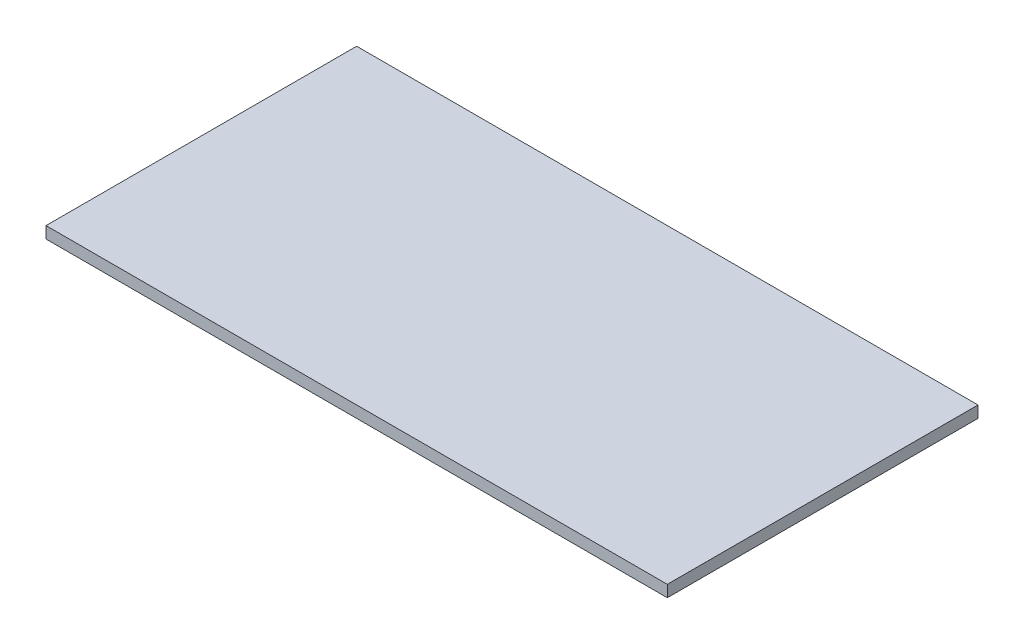
ISO-10303-21;
HEADER;
FILE_DESCRIPTION(('STEP AP214'),'2;1');
FILE_NAME('part.step','',(''),(''),'','','');
FILE_SCHEMA(('AUTOMOTIVE_DESIGN { 1 0 10303 214 1 1 1 1 }'));
ENDSEC;
DATA;
#1=APPLICATION_CONTEXT('core data for automotive mechanical design processes');
#2=APPLICATION_PROTOCOL_DEFINITION('international standard','automotive_design',2000,#1);
#3=PRODUCT_CONTEXT('',#1,'mechanical');
#4=PRODUCT('Part','Part','',(#3));
#5=PRODUCT_RELATED_PRODUCT_CATEGORY('part','',(#4));
#6=PRODUCT_DEFINITION_FORMATION('','',#4);
#7=PRODUCT_DEFINITION_CONTEXT('part definition',#1,'design');
#8=PRODUCT_DEFINITION('design','',#6,#7);
#9=PRODUCT_DEFINITION_SHAPE('','',#8);
#10=(LENGTH_UNIT() NAMED_UNIT(*) SI_UNIT(.MILLI.,.METRE.));
#11=(NAMED_UNIT(*) PLANE_ANGLE_UNIT() SI_UNIT($,.RADIAN.));
#12=(NAMED_UNIT(*) SI_UNIT($,.STERADIAN.) SOLID_ANGLE_UNIT());
#13=UNCERTAINTY_MEASURE_WITH_UNIT(LENGTH_MEASURE(1.E-05),#10,'distance_accuracy_value','');
#14=(GEOMETRIC_REPRESENTATION_CONTEXT(3) GLOBAL_UNCERTAINTY_ASSIGNED_CONTEXT((#13)) GLOBAL_UNIT_ASSIGNED_CONTEXT((#10,
#11,#12)) REPRESENTATION_CONTEXT('',''));
#15=CARTESIAN_POINT('',(0.,0.,0.));
#16=DIRECTION('',(0.,0.,1.));
#17=DIRECTION('',(1.,0.,0.));
#18=AXIS2_PLACEMENT_3D('',#15,#16,#17);
#19=CARTESIAN_POINT('',(0.,1.5,0.));
#20=DIRECTION('',(1.,0.,0.));
#21=DIRECTION('',(0.,0.,-1.));
#22=AXIS2_PLACEMENT_3D('',#19,#20,#21);
#23=PLANE('',#22);
#24=DIRECTION('',(0.,0.,1.));
#25=VECTOR('',#24,1.);
#26=CARTESIAN_POINT('',(0.,0.,0.));
#27=LINE('',#26,#25);
#28=CARTESIAN_POINT('',(0.,0.,-40.));
#29=VERTEX_POINT('',#28);
#30=CARTESIAN_POINT('',(0.,0.,0.));
#31=VERTEX_POINT('',#30);
#32=EDGE_CURVE('E107',#29,#31,#27,.T.);
#33=ORIENTED_EDGE('',*,*,#32,.T.);
#34=DIRECTION('',(0.,-1.,0.));
#35=VECTOR('',#34,1.);
#36=CARTESIAN_POINT('',(0.,1.5,0.));
#37=LINE('',#36,#35);
#38=CARTESIAN_POINT('',(0.,1.5,0.));
#39=VERTEX_POINT('',#38);
#40=EDGE_CURVE('E11',#39,#31,#37,.T.);
#41=ORIENTED_EDGE('',*,*,#40,.F.);
#42=DIRECTION('',(0.,0.,1.));
#43=VECTOR('',#42,1.);
#44=CARTESIAN_POINT('',(0.,1.5,0.));
#45=LINE('',#44,#43);
#46=CARTESIAN_POINT('',(0.,1.5,-40.));
#47=VERTEX_POINT('',#46);
#48=EDGE_CURVE('E91',#47,#39,#45,.T.);
#49=ORIENTED_EDGE('',*,*,#48,.F.);
#50=DIRECTION('',(0.,-1.,0.));
#51=VECTOR('',#50,1.);
#52=CARTESIAN_POINT('',(0.,1.5,-40.));
#53=LINE('',#52,#51);
#54=EDGE_CURVE('E103',#47,#29,#53,.T.);
#55=ORIENTED_EDGE('',*,*,#54,.T.);
#56=EDGE_LOOP('',(#33,#41,#49,#55));
#57=FACE_BOUND('',#56,.T.);
#58=ADVANCED_FACE('F39',(#57),#23,.F.);
#59=CARTESIAN_POINT('',(0.,1.5,0.));
#60=DIRECTION('',(0.,0.,-1.));
#61=DIRECTION('',(-1.,0.,0.));
#62=AXIS2_PLACEMENT_3D('',#59,#60,#61);
#63=PLANE('',#62);
#64=DIRECTION('',(1.,0.,0.));
#65=VECTOR('',#64,1.);
#66=CARTESIAN_POINT('',(0.,0.,0.));
#67=LINE('',#66,#65);
#68=CARTESIAN_POINT('',(80.,0.,0.));
#69=VERTEX_POINT('',#68);
#70=EDGE_CURVE('E96',#31,#69,#67,.T.);
#71=ORIENTED_EDGE('',*,*,#70,.T.);
#72=DIRECTION('',(0.,-1.,0.));
#73=VECTOR('',#72,1.);
#74=CARTESIAN_POINT('',(80.,1.5,0.));
#75=LINE('',#74,#73);
#76=CARTESIAN_POINT('',(80.,1.5,0.));
#77=VERTEX_POINT('',#76);
#78=EDGE_CURVE('E48',#77,#69,#75,.T.);
#79=ORIENTED_EDGE('',*,*,#78,.F.);
#80=DIRECTION('',(1.,0.,0.));
#81=VECTOR('',#80,1.);
#82=CARTESIAN_POINT('',(0.,1.5,0.));
#83=LINE('',#82,#81);
#84=EDGE_CURVE('E86',#39,#77,#83,.T.);
#85=ORIENTED_EDGE('',*,*,#84,.F.);
#86=ORIENTED_EDGE('',*,*,#40,.T.);
#87=EDGE_LOOP('',(#71,#79,#85,#86));
#88=FACE_BOUND('',#87,.T.);
#89=ADVANCED_FACE('F95',(#88),#63,.F.);
#90=CARTESIAN_POINT('',(80.,1.5,0.));
#91=DIRECTION('',(-1.,0.,0.));
#92=DIRECTION('',(0.,0.,1.));
#93=AXIS2_PLACEMENT_3D('',#90,#91,#92);
#94=PLANE('',#93);
#95=DIRECTION('',(0.,0.,-1.));
#96=VECTOR('',#95,1.);
#97=CARTESIAN_POINT('',(80.,0.,0.));
#98=LINE('',#97,#96);
#99=CARTESIAN_POINT('',(80.,0.,-40.));
#100=VERTEX_POINT('',#99);
#101=EDGE_CURVE('E73',#69,#100,#98,.T.);
#102=ORIENTED_EDGE('',*,*,#101,.T.);
#103=DIRECTION('',(0.,-1.,0.));
#104=VECTOR('',#103,1.);
#105=CARTESIAN_POINT('',(80.,1.5,-40.));
#106=LINE('',#105,#104);
#107=CARTESIAN_POINT('',(80.,1.5,-40.));
#108=VERTEX_POINT('',#107);
#109=EDGE_CURVE('E98',#108,#100,#106,.T.);
#110=ORIENTED_EDGE('',*,*,#109,.F.);
#111=DIRECTION('',(0.,0.,-1.));
#112=VECTOR('',#111,1.);
#113=CARTESIAN_POINT('',(80.,1.5,0.));
#114=LINE('',#113,#112);
#115=EDGE_CURVE('E89',#77,#108,#114,.T.);
#116=ORIENTED_EDGE('',*,*,#115,.F.);
#117=ORIENTED_EDGE('',*,*,#78,.T.);
#118=EDGE_LOOP('',(#102,#110,#116,#117));
#119=FACE_BOUND('',#118,.T.);
#120=ADVANCED_FACE('F99',(#119),#94,.F.);
#121=CARTESIAN_POINT('',(0.,1.5,-40.));
#122=DIRECTION('',(0.,0.,1.));
#123=DIRECTION('',(1.,0.,0.));
#124=AXIS2_PLACEMENT_3D('',#121,#122,#123);
#125=PLANE('',#124);
#126=DIRECTION('',(-1.,0.,0.));
#127=VECTOR('',#126,1.);
#128=CARTESIAN_POINT('',(0.,0.,-40.));
#129=LINE('',#128,#127);
#130=EDGE_CURVE('E79',#100,#29,#129,.T.);
#131=ORIENTED_EDGE('',*,*,#130,.T.);
#132=ORIENTED_EDGE('',*,*,#54,.F.);
#133=DIRECTION('',(-1.,0.,0.));
#134=VECTOR('',#133,1.);
#135=CARTESIAN_POINT('',(0.,1.5,-40.));
#136=LINE('',#135,#134);
#137=EDGE_CURVE('E56',#108,#47,#136,.T.);
#138=ORIENTED_EDGE('',*,*,#137,.F.);
#139=ORIENTED_EDGE('',*,*,#109,.T.);
#140=EDGE_LOOP('',(#131,#132,#138,#139));
#141=FACE_BOUND('',#140,.T.);
#142=ADVANCED_FACE('F120',(#141),#125,.F.);
#143=CARTESIAN_POINT('',(0.,1.5,0.));
#144=DIRECTION('',(0.,-1.,0.));
#145=DIRECTION('',(0.,0.,-1.));
#146=AXIS2_PLACEMENT_3D('',#143,#144,#145);
#147=PLANE('',#146);
#148=ORIENTED_EDGE('',*,*,#48,.T.);
#149=ORIENTED_EDGE('',*,*,#84,.T.);
#150=ORIENTED_EDGE('',*,*,#115,.T.);
#151=ORIENTED_EDGE('',*,*,#137,.T.);
#152=EDGE_LOOP('',(#148,#149,#150,#151));
#153=FACE_BOUND('',#152,.T.);
#154=ADVANCED_FACE('F87',(#153),#147,.F.);
#155=CARTESIAN_POINT('',(0.,0.,0.));
#156=DIRECTION('',(0.,-1.,0.));
#157=DIRECTION('',(0.,0.,-1.));
#158=AXIS2_PLACEMENT_3D('',#155,#156,#157);
#159=PLANE('',#158);
#160=ORIENTED_EDGE('',*,*,#32,.F.);
#161=ORIENTED_EDGE('',*,*,#130,.F.);
#162=ORIENTED_EDGE('',*,*,#101,.F.);
#163=ORIENTED_EDGE('',*,*,#70,.F.);
#164=EDGE_LOOP('',(#160,#161,#162,#163));
#165=FACE_BOUND('',#164,.T.);
#166=ADVANCED_FACE('F123',(#165),#159,.T.);
#167=CLOSED_SHELL('',(#58,#89,#120,#142,#154,#166));
#168=MANIFOLD_SOLID_BREP('B2',#167);
#169=ADVANCED_BREP_SHAPE_REPRESENTATION('',(#18,#168),#14);
#170=SHAPE_DEFINITION_REPRESENTATION(#9,#169);
ENDSEC;
END-ISO-10303-21;
